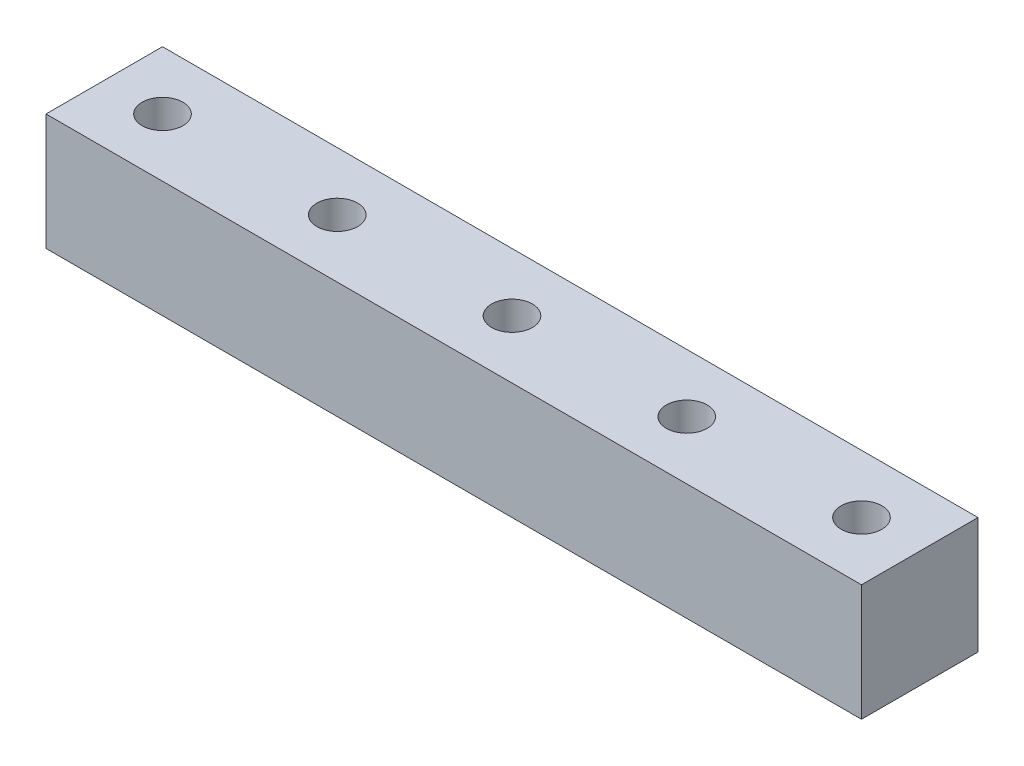
ISO-10303-21;
HEADER;
FILE_DESCRIPTION(('STEP AP214'),'2;1');
FILE_NAME('part.step','',(''),(''),'','','');
FILE_SCHEMA(('AUTOMOTIVE_DESIGN { 1 0 10303 214 1 1 1 1 }'));
ENDSEC;
DATA;
#1=APPLICATION_CONTEXT('core data for automotive mechanical design processes');
#2=APPLICATION_PROTOCOL_DEFINITION('international standard','automotive_design',2000,#1);
#3=PRODUCT_CONTEXT('',#1,'mechanical');
#4=PRODUCT('Part','Part','',(#3));
#5=PRODUCT_RELATED_PRODUCT_CATEGORY('part','',(#4));
#6=PRODUCT_DEFINITION_FORMATION('','',#4);
#7=PRODUCT_DEFINITION_CONTEXT('part definition',#1,'design');
#8=PRODUCT_DEFINITION('design','',#6,#7);
#9=PRODUCT_DEFINITION_SHAPE('','',#8);
#10=(LENGTH_UNIT() NAMED_UNIT(*) SI_UNIT(.MILLI.,.METRE.));
#11=(NAMED_UNIT(*) PLANE_ANGLE_UNIT() SI_UNIT($,.RADIAN.));
#12=(NAMED_UNIT(*) SI_UNIT($,.STERADIAN.) SOLID_ANGLE_UNIT());
#13=UNCERTAINTY_MEASURE_WITH_UNIT(LENGTH_MEASURE(1.E-05),#10,'distance_accuracy_value','');
#14=(GEOMETRIC_REPRESENTATION_CONTEXT(3) GLOBAL_UNCERTAINTY_ASSIGNED_CONTEXT((#13)) GLOBAL_UNIT_ASSIGNED_CONTEXT((#10,
#11,#12)) REPRESENTATION_CONTEXT('',''));
#15=CARTESIAN_POINT('',(0.,0.,0.));
#16=DIRECTION('',(0.,0.,1.));
#17=DIRECTION('',(1.,0.,0.));
#18=AXIS2_PLACEMENT_3D('',#15,#16,#17);
#19=CARTESIAN_POINT('',(0.,20.,0.));
#20=DIRECTION('',(0.,-1.,0.));
#21=DIRECTION('',(0.,0.,-1.));
#22=AXIS2_PLACEMENT_3D('',#19,#20,#21);
#23=PLANE('',#22);
#24=DIRECTION('',(0.,0.,-1.));
#25=VECTOR('',#24,1.);
#26=CARTESIAN_POINT('',(70.,20.,10.));
#27=LINE('',#26,#25);
#28=CARTESIAN_POINT('',(70.,20.,10.));
#29=VERTEX_POINT('',#28);
#30=CARTESIAN_POINT('',(70.,20.,-10.));
#31=VERTEX_POINT('',#30);
#32=EDGE_CURVE('E98',#29,#31,#27,.T.);
#33=ORIENTED_EDGE('',*,*,#32,.T.);
#34=DIRECTION('',(-1.,0.,0.));
#35=VECTOR('',#34,1.);
#36=CARTESIAN_POINT('',(-70.,20.,-10.));
#37=LINE('',#36,#35);
#38=CARTESIAN_POINT('',(-70.,20.,-10.));
#39=VERTEX_POINT('',#38);
#40=EDGE_CURVE('E93',#31,#39,#37,.T.);
#41=ORIENTED_EDGE('',*,*,#40,.T.);
#42=DIRECTION('',(0.,0.,1.));
#43=VECTOR('',#42,1.);
#44=CARTESIAN_POINT('',(-70.,20.,10.));
#45=LINE('',#44,#43);
#46=CARTESIAN_POINT('',(-70.,20.,10.));
#47=VERTEX_POINT('',#46);
#48=EDGE_CURVE('E96',#39,#47,#45,.T.);
#49=ORIENTED_EDGE('',*,*,#48,.T.);
#50=DIRECTION('',(1.,0.,0.));
#51=VECTOR('',#50,1.);
#52=CARTESIAN_POINT('',(-70.,20.,10.));
#53=LINE('',#52,#51);
#54=EDGE_CURVE('E63',#47,#29,#53,.T.);
#55=ORIENTED_EDGE('',*,*,#54,.T.);
#56=EDGE_LOOP('',(#33,#41,#49,#55));
#57=FACE_BOUND('',#56,.T.);
#58=CARTESIAN_POINT('',(-60.,20.,0.));
#59=DIRECTION('',(0.,1.,0.));
#60=DIRECTION('',(0.,0.,1.));
#61=AXIS2_PLACEMENT_3D('',#58,#59,#60);
#62=CIRCLE('',#61,3.5);
#63=CARTESIAN_POINT('',(-60.,20.,3.5));
#64=VERTEX_POINT('',#63);
#65=EDGE_CURVE('E118',#64,#64,#62,.T.);
#66=ORIENTED_EDGE('',*,*,#65,.F.);
#67=EDGE_LOOP('',(#66));
#68=FACE_BOUND('',#67,.T.);
#69=CARTESIAN_POINT('',(-30.,20.,0.));
#70=DIRECTION('',(0.,1.,0.));
#71=DIRECTION('',(0.,0.,1.));
#72=AXIS2_PLACEMENT_3D('',#69,#70,#71);
#73=CIRCLE('',#72,3.5);
#74=CARTESIAN_POINT('',(-30.,20.,3.5));
#75=VERTEX_POINT('',#74);
#76=EDGE_CURVE('E140',#75,#75,#73,.T.);
#77=ORIENTED_EDGE('',*,*,#76,.F.);
#78=EDGE_LOOP('',(#77));
#79=FACE_BOUND('',#78,.T.);
#80=CARTESIAN_POINT('',(0.,20.,0.));
#81=DIRECTION('',(0.,1.,0.));
#82=DIRECTION('',(0.,0.,1.));
#83=AXIS2_PLACEMENT_3D('',#80,#81,#82);
#84=CIRCLE('',#83,3.49999999999996);
#85=CARTESIAN_POINT('',(0.,20.,3.49999999999996));
#86=VERTEX_POINT('',#85);
#87=EDGE_CURVE('E148',#86,#86,#84,.T.);
#88=ORIENTED_EDGE('',*,*,#87,.F.);
#89=EDGE_LOOP('',(#88));
#90=FACE_BOUND('',#89,.T.);
#91=CARTESIAN_POINT('',(30.,20.,0.));
#92=DIRECTION('',(0.,1.,0.));
#93=DIRECTION('',(0.,0.,1.));
#94=AXIS2_PLACEMENT_3D('',#91,#92,#93);
#95=CIRCLE('',#94,3.5);
#96=CARTESIAN_POINT('',(30.,20.,3.49999999999999));
#97=VERTEX_POINT('',#96);
#98=EDGE_CURVE('E156',#97,#97,#95,.T.);
#99=ORIENTED_EDGE('',*,*,#98,.F.);
#100=EDGE_LOOP('',(#99));
#101=FACE_BOUND('',#100,.T.);
#102=CARTESIAN_POINT('',(60.,20.,0.));
#103=DIRECTION('',(0.,1.,0.));
#104=DIRECTION('',(0.,0.,1.));
#105=AXIS2_PLACEMENT_3D('',#102,#103,#104);
#106=CIRCLE('',#105,3.50000000000001);
#107=CARTESIAN_POINT('',(60.,20.,3.5));
#108=VERTEX_POINT('',#107);
#109=EDGE_CURVE('E164',#108,#108,#106,.T.);
#110=ORIENTED_EDGE('',*,*,#109,.F.);
#111=EDGE_LOOP('',(#110));
#112=FACE_BOUND('',#111,.T.);
#113=ADVANCED_FACE('F45',(#57,#68,#79,#90,#101,#112),#23,.F.);
#114=CARTESIAN_POINT('',(0.,0.,0.));
#115=DIRECTION('',(0.,-1.,0.));
#116=DIRECTION('',(0.,0.,-1.));
#117=AXIS2_PLACEMENT_3D('',#114,#115,#116);
#118=PLANE('',#117);
#119=CARTESIAN_POINT('',(30.,0.,0.));
#120=DIRECTION('',(0.,1.,0.));
#121=DIRECTION('',(0.,0.,1.));
#122=AXIS2_PLACEMENT_3D('',#119,#120,#121);
#123=CIRCLE('',#122,3.5);
#124=CARTESIAN_POINT('',(30.,0.,3.49999999999999));
#125=VERTEX_POINT('',#124);
#126=EDGE_CURVE('E160',#125,#125,#123,.T.);
#127=ORIENTED_EDGE('',*,*,#126,.T.);
#128=EDGE_LOOP('',(#127));
#129=FACE_BOUND('',#128,.T.);
#130=CARTESIAN_POINT('',(-30.,0.,0.));
#131=DIRECTION('',(0.,1.,0.));
#132=DIRECTION('',(0.,0.,1.));
#133=AXIS2_PLACEMENT_3D('',#130,#131,#132);
#134=CIRCLE('',#133,3.5);
#135=CARTESIAN_POINT('',(-30.,0.,3.5));
#136=VERTEX_POINT('',#135);
#137=EDGE_CURVE('E144',#136,#136,#134,.T.);
#138=ORIENTED_EDGE('',*,*,#137,.T.);
#139=EDGE_LOOP('',(#138));
#140=FACE_BOUND('',#139,.T.);
#141=DIRECTION('',(0.,0.,-1.));
#142=VECTOR('',#141,1.);
#143=CARTESIAN_POINT('',(70.,0.,10.));
#144=LINE('',#143,#142);
#145=CARTESIAN_POINT('',(70.,0.,10.));
#146=VERTEX_POINT('',#145);
#147=CARTESIAN_POINT('',(70.,0.,-10.));
#148=VERTEX_POINT('',#147);
#149=EDGE_CURVE('E114',#146,#148,#144,.T.);
#150=ORIENTED_EDGE('',*,*,#149,.F.);
#151=DIRECTION('',(1.,0.,0.));
#152=VECTOR('',#151,1.);
#153=CARTESIAN_POINT('',(-70.,0.,10.));
#154=LINE('',#153,#152);
#155=CARTESIAN_POINT('',(-70.,0.,10.));
#156=VERTEX_POINT('',#155);
#157=EDGE_CURVE('E86',#156,#146,#154,.T.);
#158=ORIENTED_EDGE('',*,*,#157,.F.);
#159=DIRECTION('',(0.,0.,1.));
#160=VECTOR('',#159,1.);
#161=CARTESIAN_POINT('',(-70.,0.,10.));
#162=LINE('',#161,#160);
#163=CARTESIAN_POINT('',(-70.,0.,-10.));
#164=VERTEX_POINT('',#163);
#165=EDGE_CURVE('E80',#164,#156,#162,.T.);
#166=ORIENTED_EDGE('',*,*,#165,.F.);
#167=DIRECTION('',(-1.,0.,0.));
#168=VECTOR('',#167,1.);
#169=CARTESIAN_POINT('',(-70.,0.,-10.));
#170=LINE('',#169,#168);
#171=EDGE_CURVE('E103',#148,#164,#170,.T.);
#172=ORIENTED_EDGE('',*,*,#171,.F.);
#173=EDGE_LOOP('',(#150,#158,#166,#172));
#174=FACE_BOUND('',#173,.T.);
#175=CARTESIAN_POINT('',(-60.,0.,0.));
#176=DIRECTION('',(0.,1.,0.));
#177=DIRECTION('',(0.,0.,1.));
#178=AXIS2_PLACEMENT_3D('',#175,#176,#177);
#179=CIRCLE('',#178,3.5);
#180=CARTESIAN_POINT('',(-60.,0.,3.5));
#181=VERTEX_POINT('',#180);
#182=EDGE_CURVE('E136',#181,#181,#179,.T.);
#183=ORIENTED_EDGE('',*,*,#182,.T.);
#184=EDGE_LOOP('',(#183));
#185=FACE_BOUND('',#184,.T.);
#186=CARTESIAN_POINT('',(0.,0.,0.));
#187=DIRECTION('',(0.,1.,0.));
#188=DIRECTION('',(0.,0.,1.));
#189=AXIS2_PLACEMENT_3D('',#186,#187,#188);
#190=CIRCLE('',#189,3.49999999999996);
#191=CARTESIAN_POINT('',(0.,0.,3.49999999999996));
#192=VERTEX_POINT('',#191);
#193=EDGE_CURVE('E152',#192,#192,#190,.T.);
#194=ORIENTED_EDGE('',*,*,#193,.T.);
#195=EDGE_LOOP('',(#194));
#196=FACE_BOUND('',#195,.T.);
#197=CARTESIAN_POINT('',(60.,0.,0.));
#198=DIRECTION('',(0.,1.,0.));
#199=DIRECTION('',(0.,0.,1.));
#200=AXIS2_PLACEMENT_3D('',#197,#198,#199);
#201=CIRCLE('',#200,3.50000000000001);
#202=CARTESIAN_POINT('',(60.,0.,3.5));
#203=VERTEX_POINT('',#202);
#204=EDGE_CURVE('E168',#203,#203,#201,.T.);
#205=ORIENTED_EDGE('',*,*,#204,.T.);
#206=EDGE_LOOP('',(#205));
#207=FACE_BOUND('',#206,.T.);
#208=ADVANCED_FACE('F131',(#129,#140,#174,#185,#196,#207),#118,.T.);
#209=CARTESIAN_POINT('',(70.,20.,10.));
#210=DIRECTION('',(-1.,0.,0.));
#211=DIRECTION('',(0.,0.,1.));
#212=AXIS2_PLACEMENT_3D('',#209,#210,#211);
#213=PLANE('',#212);
#214=ORIENTED_EDGE('',*,*,#149,.T.);
#215=DIRECTION('',(0.,-1.,0.));
#216=VECTOR('',#215,1.);
#217=CARTESIAN_POINT('',(70.,20.,-10.));
#218=LINE('',#217,#216);
#219=EDGE_CURVE('E11',#31,#148,#218,.T.);
#220=ORIENTED_EDGE('',*,*,#219,.F.);
#221=ORIENTED_EDGE('',*,*,#32,.F.);
#222=DIRECTION('',(0.,-1.,0.));
#223=VECTOR('',#222,1.);
#224=CARTESIAN_POINT('',(70.,20.,10.));
#225=LINE('',#224,#223);
#226=EDGE_CURVE('E110',#29,#146,#225,.T.);
#227=ORIENTED_EDGE('',*,*,#226,.T.);
#228=EDGE_LOOP('',(#214,#220,#221,#227));
#229=FACE_BOUND('',#228,.T.);
#230=ADVANCED_FACE('F47',(#229),#213,.F.);
#231=CARTESIAN_POINT('',(-70.,20.,-10.));
#232=DIRECTION('',(0.,0.,1.));
#233=DIRECTION('',(1.,0.,0.));
#234=AXIS2_PLACEMENT_3D('',#231,#232,#233);
#235=PLANE('',#234);
#236=ORIENTED_EDGE('',*,*,#171,.T.);
#237=DIRECTION('',(0.,-1.,0.));
#238=VECTOR('',#237,1.);
#239=CARTESIAN_POINT('',(-70.,20.,-10.));
#240=LINE('',#239,#238);
#241=EDGE_CURVE('E55',#39,#164,#240,.T.);
#242=ORIENTED_EDGE('',*,*,#241,.F.);
#243=ORIENTED_EDGE('',*,*,#40,.F.);
#244=ORIENTED_EDGE('',*,*,#219,.T.);
#245=EDGE_LOOP('',(#236,#242,#243,#244));
#246=FACE_BOUND('',#245,.T.);
#247=ADVANCED_FACE('F102',(#246),#235,.F.);
#248=CARTESIAN_POINT('',(-70.,20.,10.));
#249=DIRECTION('',(1.,0.,0.));
#250=DIRECTION('',(0.,0.,-1.));
#251=AXIS2_PLACEMENT_3D('',#248,#249,#250);
#252=PLANE('',#251);
#253=ORIENTED_EDGE('',*,*,#165,.T.);
#254=DIRECTION('',(0.,-1.,0.));
#255=VECTOR('',#254,1.);
#256=CARTESIAN_POINT('',(-70.,20.,10.));
#257=LINE('',#256,#255);
#258=EDGE_CURVE('E105',#47,#156,#257,.T.);
#259=ORIENTED_EDGE('',*,*,#258,.F.);
#260=ORIENTED_EDGE('',*,*,#48,.F.);
#261=ORIENTED_EDGE('',*,*,#241,.T.);
#262=EDGE_LOOP('',(#253,#259,#260,#261));
#263=FACE_BOUND('',#262,.T.);
#264=ADVANCED_FACE('F106',(#263),#252,.F.);
#265=CARTESIAN_POINT('',(-70.,20.,10.));
#266=DIRECTION('',(0.,0.,-1.));
#267=DIRECTION('',(-1.,0.,0.));
#268=AXIS2_PLACEMENT_3D('',#265,#266,#267);
#269=PLANE('',#268);
#270=ORIENTED_EDGE('',*,*,#157,.T.);
#271=ORIENTED_EDGE('',*,*,#226,.F.);
#272=ORIENTED_EDGE('',*,*,#54,.F.);
#273=ORIENTED_EDGE('',*,*,#258,.T.);
#274=EDGE_LOOP('',(#270,#271,#272,#273));
#275=FACE_BOUND('',#274,.T.);
#276=ADVANCED_FACE('F128',(#275),#269,.F.);
#277=CARTESIAN_POINT('',(-60.,20.,0.));
#278=DIRECTION('',(0.,-1.,0.));
#279=DIRECTION('',(0.,0.,-1.));
#280=AXIS2_PLACEMENT_3D('',#277,#278,#279);
#281=CYLINDRICAL_SURFACE('',#280,3.5);
#282=ORIENTED_EDGE('',*,*,#65,.T.);
#283=EDGE_LOOP('',(#282));
#284=FACE_BOUND('',#283,.T.);
#285=ORIENTED_EDGE('',*,*,#182,.F.);
#286=EDGE_LOOP('',(#285));
#287=FACE_BOUND('',#286,.T.);
#288=ADVANCED_FACE('F187',(#284,#287),#281,.F.);
#289=CARTESIAN_POINT('',(-30.,20.,0.));
#290=DIRECTION('',(0.,-1.,0.));
#291=DIRECTION('',(0.,0.,-1.));
#292=AXIS2_PLACEMENT_3D('',#289,#290,#291);
#293=CYLINDRICAL_SURFACE('',#292,3.5);
#294=ORIENTED_EDGE('',*,*,#76,.T.);
#295=EDGE_LOOP('',(#294));
#296=FACE_BOUND('',#295,.T.);
#297=ORIENTED_EDGE('',*,*,#137,.F.);
#298=EDGE_LOOP('',(#297));
#299=FACE_BOUND('',#298,.T.);
#300=ADVANCED_FACE('F232',(#296,#299),#293,.F.);
#301=CARTESIAN_POINT('',(0.,20.,0.));
#302=DIRECTION('',(0.,-1.,0.));
#303=DIRECTION('',(0.,0.,-1.));
#304=AXIS2_PLACEMENT_3D('',#301,#302,#303);
#305=CYLINDRICAL_SURFACE('',#304,3.49999999999996);
#306=ORIENTED_EDGE('',*,*,#87,.T.);
#307=EDGE_LOOP('',(#306));
#308=FACE_BOUND('',#307,.T.);
#309=ORIENTED_EDGE('',*,*,#193,.F.);
#310=EDGE_LOOP('',(#309));
#311=FACE_BOUND('',#310,.T.);
#312=ADVANCED_FACE('F240',(#308,#311),#305,.F.);
#313=CARTESIAN_POINT('',(30.,20.,0.));
#314=DIRECTION('',(0.,-1.,0.));
#315=DIRECTION('',(0.,0.,-1.));
#316=AXIS2_PLACEMENT_3D('',#313,#314,#315);
#317=CYLINDRICAL_SURFACE('',#316,3.5);
#318=ORIENTED_EDGE('',*,*,#98,.T.);
#319=EDGE_LOOP('',(#318));
#320=FACE_BOUND('',#319,.T.);
#321=ORIENTED_EDGE('',*,*,#126,.F.);
#322=EDGE_LOOP('',(#321));
#323=FACE_BOUND('',#322,.T.);
#324=ADVANCED_FACE('F248',(#320,#323),#317,.F.);
#325=CARTESIAN_POINT('',(60.,20.,0.));
#326=DIRECTION('',(0.,-1.,0.));
#327=DIRECTION('',(0.,0.,-1.));
#328=AXIS2_PLACEMENT_3D('',#325,#326,#327);
#329=CYLINDRICAL_SURFACE('',#328,3.50000000000001);
#330=ORIENTED_EDGE('',*,*,#109,.T.);
#331=EDGE_LOOP('',(#330));
#332=FACE_BOUND('',#331,.T.);
#333=ORIENTED_EDGE('',*,*,#204,.F.);
#334=EDGE_LOOP('',(#333));
#335=FACE_BOUND('',#334,.T.);
#336=ADVANCED_FACE('F176',(#332,#335),#329,.F.);
#337=CLOSED_SHELL('',(#113,#208,#230,#247,#264,#276,#288,#300,#312,#324,#336));
#338=MANIFOLD_SOLID_BREP('B2',#337);
#339=ADVANCED_BREP_SHAPE_REPRESENTATION('',(#18,#338),#14);
#340=SHAPE_DEFINITION_REPRESENTATION(#9,#339);
ENDSEC;
END-ISO-10303-21;
